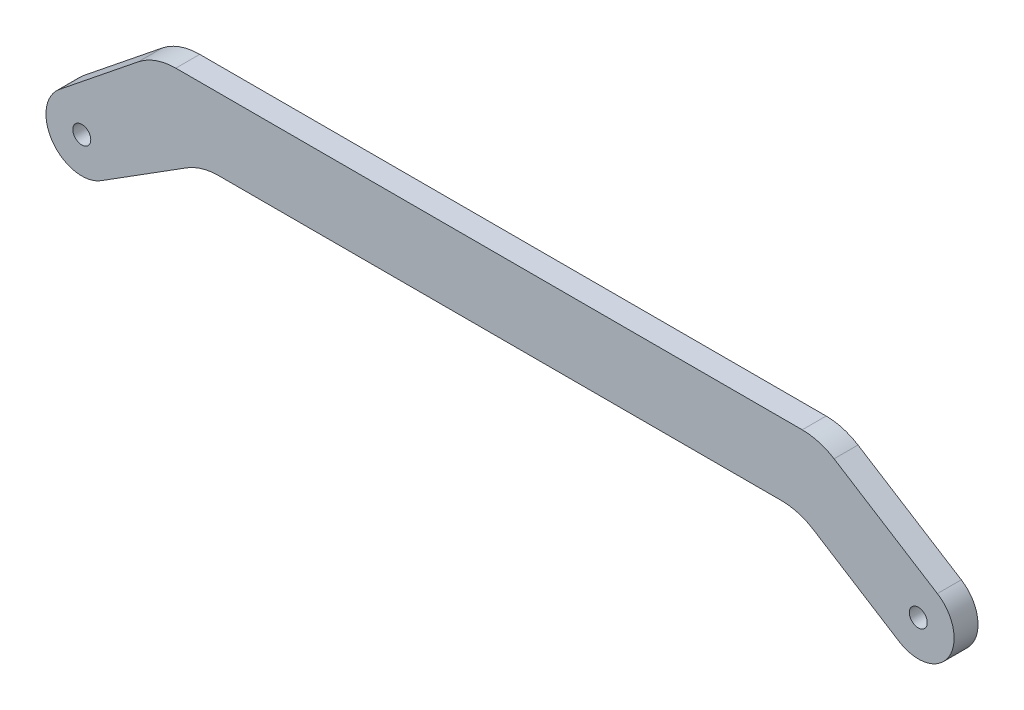
ISO-10303-21;
HEADER;
FILE_DESCRIPTION(('STEP AP214'),'2;1');
FILE_NAME('part.step','',(''),(''),'','','');
FILE_SCHEMA(('AUTOMOTIVE_DESIGN { 1 0 10303 214 1 1 1 1 }'));
ENDSEC;
DATA;
#1=APPLICATION_CONTEXT('core data for automotive mechanical design processes');
#2=APPLICATION_PROTOCOL_DEFINITION('international standard','automotive_design',2000,#1);
#3=PRODUCT_CONTEXT('',#1,'mechanical');
#4=PRODUCT('Part','Part','',(#3));
#5=PRODUCT_RELATED_PRODUCT_CATEGORY('part','',(#4));
#6=PRODUCT_DEFINITION_FORMATION('','',#4);
#7=PRODUCT_DEFINITION_CONTEXT('part definition',#1,'design');
#8=PRODUCT_DEFINITION('design','',#6,#7);
#9=PRODUCT_DEFINITION_SHAPE('','',#8);
#10=(LENGTH_UNIT() NAMED_UNIT(*) SI_UNIT(.MILLI.,.METRE.));
#11=(NAMED_UNIT(*) PLANE_ANGLE_UNIT() SI_UNIT($,.RADIAN.));
#12=(NAMED_UNIT(*) SI_UNIT($,.STERADIAN.) SOLID_ANGLE_UNIT());
#13=UNCERTAINTY_MEASURE_WITH_UNIT(LENGTH_MEASURE(1.E-05),#10,'distance_accuracy_value','');
#14=(GEOMETRIC_REPRESENTATION_CONTEXT(3) GLOBAL_UNCERTAINTY_ASSIGNED_CONTEXT((#13)) GLOBAL_UNIT_ASSIGNED_CONTEXT((#10,
#11,#12)) REPRESENTATION_CONTEXT('',''));
#15=CARTESIAN_POINT('',(0.,0.,0.));
#16=DIRECTION('',(0.,0.,1.));
#17=DIRECTION('',(1.,0.,0.));
#18=AXIS2_PLACEMENT_3D('',#15,#16,#17);
#19=CARTESIAN_POINT('',(15.7364952951131,7.50778352946216,4.));
#20=DIRECTION('',(0.,0.,-1.));
#21=DIRECTION('',(-1.,0.,0.));
#22=AXIS2_PLACEMENT_3D('',#19,#20,#21);
#23=CYLINDRICAL_SURFACE('',#22,10.);
#24=CARTESIAN_POINT('',(15.7364952951131,7.50778352946216,0.));
#25=DIRECTION('',(0.,0.,1.));
#26=DIRECTION('',(1.,0.,0.));
#27=AXIS2_PLACEMENT_3D('',#24,#25,#26);
#28=CIRCLE('',#27,10.);
#29=CARTESIAN_POINT('',(9.47479683384796,15.304650360452,0.));
#30=VERTEX_POINT('',#29);
#31=CARTESIAN_POINT('',(15.7364952951131,17.5077835294622,0.));
#32=VERTEX_POINT('',#31);
#33=EDGE_CURVE('E157',#30,#32,#28,.F.);
#34=ORIENTED_EDGE('',*,*,#33,.F.);
#35=DIRECTION('',(0.,0.,-1.));
#36=VECTOR('',#35,1.);
#37=CARTESIAN_POINT('',(9.47479683384796,15.304650360452,4.));
#38=LINE('',#37,#36);
#39=CARTESIAN_POINT('',(9.47479683384796,15.304650360452,4.));
#40=VERTEX_POINT('',#39);
#41=EDGE_CURVE('E11',#40,#30,#38,.T.);
#42=ORIENTED_EDGE('',*,*,#41,.F.);
#43=CARTESIAN_POINT('',(15.7364952951131,7.50778352946216,4.));
#44=DIRECTION('',(0.,0.,1.));
#45=DIRECTION('',(1.,0.,0.));
#46=AXIS2_PLACEMENT_3D('',#43,#44,#45);
#47=CIRCLE('',#46,10.);
#48=CARTESIAN_POINT('',(15.7364952951131,17.5077835294622,4.));
#49=VERTEX_POINT('',#48);
#50=EDGE_CURVE('E193',#40,#49,#47,.F.);
#51=ORIENTED_EDGE('',*,*,#50,.T.);
#52=DIRECTION('',(0.,0.,-1.));
#53=VECTOR('',#52,1.);
#54=CARTESIAN_POINT('',(15.7364952951131,17.5077835294622,4.));
#55=LINE('',#54,#53);
#56=EDGE_CURVE('E50',#49,#32,#55,.T.);
#57=ORIENTED_EDGE('',*,*,#56,.T.);
#58=EDGE_LOOP('',(#34,#42,#51,#57));
#59=FACE_BOUND('',#58,.T.);
#60=ADVANCED_FACE('F34',(#59),#23,.T.);
#61=CARTESIAN_POINT('',(-3.75701907675908,4.67812009859392,4.));
#62=DIRECTION('',(-0.626169846126513,0.779686683098986,0.));
#63=DIRECTION('',(-0.779686683098986,-0.626169846126513,0.));
#64=AXIS2_PLACEMENT_3D('',#61,#62,#63);
#65=PLANE('',#64);
#66=DIRECTION('',(0.779686683098986,0.626169846126513,0.));
#67=VECTOR('',#66,1.);
#68=CARTESIAN_POINT('',(-3.75701907675908,4.67812009859392,0.));
#69=LINE('',#68,#67);
#70=CARTESIAN_POINT('',(-3.75701907675908,4.67812009859392,0.));
#71=VERTEX_POINT('',#70);
#72=EDGE_CURVE('E159',#71,#30,#69,.T.);
#73=ORIENTED_EDGE('',*,*,#72,.F.);
#74=DIRECTION('',(0.,0.,-1.));
#75=VECTOR('',#74,1.);
#76=CARTESIAN_POINT('',(-3.75701907675908,4.67812009859392,4.));
#77=LINE('',#76,#75);
#78=CARTESIAN_POINT('',(-3.75701907675908,4.67812009859392,4.));
#79=VERTEX_POINT('',#78);
#80=EDGE_CURVE('E42',#79,#71,#77,.T.);
#81=ORIENTED_EDGE('',*,*,#80,.F.);
#82=DIRECTION('',(0.779686683098986,0.626169846126513,0.));
#83=VECTOR('',#82,1.);
#84=CARTESIAN_POINT('',(-3.75701907675908,4.67812009859392,4.));
#85=LINE('',#84,#83);
#86=EDGE_CURVE('E226',#79,#40,#85,.T.);
#87=ORIENTED_EDGE('',*,*,#86,.T.);
#88=ORIENTED_EDGE('',*,*,#41,.T.);
#89=EDGE_LOOP('',(#73,#81,#87,#88));
#90=FACE_BOUND('',#89,.T.);
#91=ADVANCED_FACE('F225',(#90),#65,.T.);
#92=CARTESIAN_POINT('',(0.,0.,4.));
#93=DIRECTION('',(0.,0.,-1.));
#94=DIRECTION('',(-1.,0.,0.));
#95=AXIS2_PLACEMENT_3D('',#92,#93,#94);
#96=CYLINDRICAL_SURFACE('',#95,6.);
#97=CARTESIAN_POINT('',(0.,0.,0.));
#98=DIRECTION('',(0.,0.,1.));
#99=DIRECTION('',(1.,0.,0.));
#100=AXIS2_PLACEMENT_3D('',#97,#98,#99);
#101=CIRCLE('',#100,6.);
#102=CARTESIAN_POINT('',(3.19805613686114,-5.07665607910215,0.));
#103=VERTEX_POINT('',#102);
#104=EDGE_CURVE('E162',#71,#103,#101,.T.);
#105=ORIENTED_EDGE('',*,*,#104,.T.);
#106=DIRECTION('',(0.,0.,-1.));
#107=VECTOR('',#106,1.);
#108=CARTESIAN_POINT('',(3.19805613686114,-5.07665607910215,4.));
#109=LINE('',#108,#107);
#110=CARTESIAN_POINT('',(3.19805613686114,-5.07665607910215,4.));
#111=VERTEX_POINT('',#110);
#112=EDGE_CURVE('E209',#111,#103,#109,.T.);
#113=ORIENTED_EDGE('',*,*,#112,.F.);
#114=CARTESIAN_POINT('',(0.,0.,4.));
#115=DIRECTION('',(0.,0.,1.));
#116=DIRECTION('',(1.,0.,0.));
#117=AXIS2_PLACEMENT_3D('',#114,#115,#116);
#118=CIRCLE('',#117,6.);
#119=EDGE_CURVE('E215',#79,#111,#118,.T.);
#120=ORIENTED_EDGE('',*,*,#119,.F.);
#121=ORIENTED_EDGE('',*,*,#80,.T.);
#122=EDGE_LOOP('',(#105,#113,#120,#121));
#123=FACE_BOUND('',#122,.T.);
#124=ADVANCED_FACE('F213',(#123),#96,.T.);
#125=CARTESIAN_POINT('',(3.19805613686114,-5.07665607910215,4.));
#126=DIRECTION('',(0.533009356143523,-0.846109346517025,0.));
#127=DIRECTION('',(0.846109346517025,0.533009356143523,0.));
#128=AXIS2_PLACEMENT_3D('',#125,#126,#127);
#129=PLANE('',#128);
#130=DIRECTION('',(-0.846109346517025,-0.533009356143523,0.));
#131=VECTOR('',#130,1.);
#132=CARTESIAN_POINT('',(3.19805613686114,-5.07665607910215,0.));
#133=LINE('',#132,#131);
#134=CARTESIAN_POINT('',(17.5571100440778,3.96887699463241,0.));
#135=VERTEX_POINT('',#134);
#136=EDGE_CURVE('E165',#135,#103,#133,.T.);
#137=ORIENTED_EDGE('',*,*,#136,.F.);
#138=DIRECTION('',(0.,0.,-1.));
#139=VECTOR('',#138,1.);
#140=CARTESIAN_POINT('',(17.5571100440778,3.96887699463241,4.));
#141=LINE('',#140,#139);
#142=CARTESIAN_POINT('',(17.5571100440778,3.96887699463241,4.));
#143=VERTEX_POINT('',#142);
#144=EDGE_CURVE('E207',#143,#135,#141,.T.);
#145=ORIENTED_EDGE('',*,*,#144,.F.);
#146=DIRECTION('',(-0.846109346517025,-0.533009356143523,0.));
#147=VECTOR('',#146,1.);
#148=CARTESIAN_POINT('',(3.19805613686114,-5.07665607910215,4.));
#149=LINE('',#148,#147);
#150=EDGE_CURVE('E385',#143,#111,#149,.T.);
#151=ORIENTED_EDGE('',*,*,#150,.T.);
#152=ORIENTED_EDGE('',*,*,#112,.T.);
#153=EDGE_LOOP('',(#137,#145,#151,#152));
#154=FACE_BOUND('',#153,.T.);
#155=ADVANCED_FACE('F248',(#154),#129,.T.);
#156=CARTESIAN_POINT('',(22.887203605513,-4.49221647053784,4.));
#157=DIRECTION('',(0.,0.,-1.));
#158=DIRECTION('',(-1.,0.,0.));
#159=AXIS2_PLACEMENT_3D('',#156,#157,#158);
#160=CYLINDRICAL_SURFACE('',#159,10.);
#161=CARTESIAN_POINT('',(22.887203605513,-4.49221647053784,0.));
#162=DIRECTION('',(0.,0.,1.));
#163=DIRECTION('',(1.,0.,0.));
#164=AXIS2_PLACEMENT_3D('',#161,#162,#163);
#165=CIRCLE('',#164,10.);
#166=CARTESIAN_POINT('',(22.887203605513,5.50778352946216,0.));
#167=VERTEX_POINT('',#166);
#168=EDGE_CURVE('E168',#135,#167,#165,.F.);
#169=ORIENTED_EDGE('',*,*,#168,.T.);
#170=DIRECTION('',(0.,0.,-1.));
#171=VECTOR('',#170,1.);
#172=CARTESIAN_POINT('',(22.887203605513,5.50778352946216,4.));
#173=LINE('',#172,#171);
#174=CARTESIAN_POINT('',(22.887203605513,5.50778352946216,4.));
#175=VERTEX_POINT('',#174);
#176=EDGE_CURVE('E204',#175,#167,#173,.T.);
#177=ORIENTED_EDGE('',*,*,#176,.F.);
#178=CARTESIAN_POINT('',(22.887203605513,-4.49221647053784,4.));
#179=DIRECTION('',(0.,0.,1.));
#180=DIRECTION('',(1.,0.,0.));
#181=AXIS2_PLACEMENT_3D('',#178,#179,#180);
#182=CIRCLE('',#181,10.);
#183=EDGE_CURVE('E386',#143,#175,#182,.F.);
#184=ORIENTED_EDGE('',*,*,#183,.F.);
#185=ORIENTED_EDGE('',*,*,#144,.T.);
#186=EDGE_LOOP('',(#169,#177,#184,#185));
#187=FACE_BOUND('',#186,.T.);
#188=ADVANCED_FACE('F253',(#187),#160,.F.);
#189=CARTESIAN_POINT('',(0.,5.50778352946216,4.));
#190=DIRECTION('',(0.,1.,0.));
#191=DIRECTION('',(-1.,0.,0.));
#192=AXIS2_PLACEMENT_3D('',#189,#190,#191);
#193=PLANE('',#192);
#194=DIRECTION('',(1.,0.,0.));
#195=VECTOR('',#194,1.);
#196=CARTESIAN_POINT('',(0.,5.50778352946216,0.));
#197=LINE('',#196,#195);
#198=CARTESIAN_POINT('',(117.112796394487,5.50778352946216,0.));
#199=VERTEX_POINT('',#198);
#200=EDGE_CURVE('E170',#167,#199,#197,.T.);
#201=ORIENTED_EDGE('',*,*,#200,.T.);
#202=DIRECTION('',(0.,0.,-1.));
#203=VECTOR('',#202,1.);
#204=CARTESIAN_POINT('',(117.112796394487,5.50778352946216,4.));
#205=LINE('',#204,#203);
#206=CARTESIAN_POINT('',(117.112796394487,5.50778352946216,4.));
#207=VERTEX_POINT('',#206);
#208=EDGE_CURVE('E202',#207,#199,#205,.T.);
#209=ORIENTED_EDGE('',*,*,#208,.F.);
#210=DIRECTION('',(1.,0.,0.));
#211=VECTOR('',#210,1.);
#212=CARTESIAN_POINT('',(0.,5.50778352946216,4.));
#213=LINE('',#212,#211);
#214=EDGE_CURVE('E388',#175,#207,#213,.T.);
#215=ORIENTED_EDGE('',*,*,#214,.F.);
#216=ORIENTED_EDGE('',*,*,#176,.T.);
#217=EDGE_LOOP('',(#201,#209,#215,#216));
#218=FACE_BOUND('',#217,.T.);
#219=ADVANCED_FACE('F257',(#218),#193,.F.);
#220=CARTESIAN_POINT('',(117.112796394487,-4.49221647053784,4.));
#221=DIRECTION('',(0.,0.,-1.));
#222=DIRECTION('',(-1.,0.,0.));
#223=AXIS2_PLACEMENT_3D('',#220,#221,#222);
#224=CYLINDRICAL_SURFACE('',#223,10.);
#225=CARTESIAN_POINT('',(117.112796394487,-4.49221647053784,0.));
#226=DIRECTION('',(0.,0.,1.));
#227=DIRECTION('',(1.,0.,0.));
#228=AXIS2_PLACEMENT_3D('',#225,#226,#227);
#229=CIRCLE('',#228,10.);
#230=CARTESIAN_POINT('',(122.442889955922,3.96887699463241,0.));
#231=VERTEX_POINT('',#230);
#232=EDGE_CURVE('E173',#231,#199,#229,.T.);
#233=ORIENTED_EDGE('',*,*,#232,.F.);
#234=DIRECTION('',(0.,0.,-1.));
#235=VECTOR('',#234,1.);
#236=CARTESIAN_POINT('',(122.442889955922,3.96887699463241,4.));
#237=LINE('',#236,#235);
#238=CARTESIAN_POINT('',(122.442889955922,3.96887699463241,4.));
#239=VERTEX_POINT('',#238);
#240=EDGE_CURVE('E200',#239,#231,#237,.T.);
#241=ORIENTED_EDGE('',*,*,#240,.F.);
#242=CARTESIAN_POINT('',(117.112796394487,-4.49221647053784,4.));
#243=DIRECTION('',(0.,0.,1.));
#244=DIRECTION('',(1.,0.,0.));
#245=AXIS2_PLACEMENT_3D('',#242,#243,#244);
#246=CIRCLE('',#245,10.);
#247=EDGE_CURVE('E379',#239,#207,#246,.T.);
#248=ORIENTED_EDGE('',*,*,#247,.T.);
#249=ORIENTED_EDGE('',*,*,#208,.T.);
#250=EDGE_LOOP('',(#233,#241,#248,#249));
#251=FACE_BOUND('',#250,.T.);
#252=ADVANCED_FACE('F261',(#251),#224,.F.);
#253=CARTESIAN_POINT('',(36.5758001862535,58.0611316428658,4.));
#254=DIRECTION('',(0.533009356143524,0.846109346517025,0.));
#255=DIRECTION('',(-0.846109346517025,0.533009356143524,0.));
#256=AXIS2_PLACEMENT_3D('',#253,#254,#255);
#257=PLANE('',#256);
#258=DIRECTION('',(0.846109346517025,-0.533009356143524,0.));
#259=VECTOR('',#258,1.);
#260=CARTESIAN_POINT('',(36.5758001862535,58.0611316428658,0.));
#261=LINE('',#260,#259);
#262=CARTESIAN_POINT('',(136.801943863139,-5.07665607910217,0.));
#263=VERTEX_POINT('',#262);
#264=EDGE_CURVE('E176',#231,#263,#261,.T.);
#265=ORIENTED_EDGE('',*,*,#264,.T.);
#266=DIRECTION('',(0.,0.,-1.));
#267=VECTOR('',#266,1.);
#268=CARTESIAN_POINT('',(136.801943863139,-5.07665607910217,4.));
#269=LINE('',#268,#267);
#270=CARTESIAN_POINT('',(136.801943863139,-5.07665607910217,4.));
#271=VERTEX_POINT('',#270);
#272=EDGE_CURVE('E197',#271,#263,#269,.T.);
#273=ORIENTED_EDGE('',*,*,#272,.F.);
#274=DIRECTION('',(0.846109346517025,-0.533009356143524,0.));
#275=VECTOR('',#274,1.);
#276=CARTESIAN_POINT('',(36.5758001862535,58.0611316428658,4.));
#277=LINE('',#276,#275);
#278=EDGE_CURVE('E395',#239,#271,#277,.T.);
#279=ORIENTED_EDGE('',*,*,#278,.F.);
#280=ORIENTED_EDGE('',*,*,#240,.T.);
#281=EDGE_LOOP('',(#265,#273,#279,#280));
#282=FACE_BOUND('',#281,.T.);
#283=ADVANCED_FACE('F265',(#282),#257,.F.);
#284=CARTESIAN_POINT('',(140.,0.,4.));
#285=DIRECTION('',(0.,0.,-1.));
#286=DIRECTION('',(-1.,0.,0.));
#287=AXIS2_PLACEMENT_3D('',#284,#285,#286);
#288=CYLINDRICAL_SURFACE('',#287,6.);
#289=CARTESIAN_POINT('',(140.,0.,0.));
#290=DIRECTION('',(0.,0.,1.));
#291=DIRECTION('',(1.,0.,0.));
#292=AXIS2_PLACEMENT_3D('',#289,#290,#291);
#293=CIRCLE('',#292,6.);
#294=CARTESIAN_POINT('',(143.198056136861,5.07665607910213,0.));
#295=VERTEX_POINT('',#294);
#296=EDGE_CURVE('E178',#263,#295,#293,.T.);
#297=ORIENTED_EDGE('',*,*,#296,.T.);
#298=DIRECTION('',(0.,0.,-1.));
#299=VECTOR('',#298,1.);
#300=CARTESIAN_POINT('',(143.198056136861,5.07665607910213,4.));
#301=LINE('',#300,#299);
#302=CARTESIAN_POINT('',(143.198056136861,5.07665607910213,4.));
#303=VERTEX_POINT('',#302);
#304=EDGE_CURVE('E133',#303,#295,#301,.T.);
#305=ORIENTED_EDGE('',*,*,#304,.F.);
#306=CARTESIAN_POINT('',(140.,0.,4.));
#307=DIRECTION('',(0.,0.,1.));
#308=DIRECTION('',(1.,0.,0.));
#309=AXIS2_PLACEMENT_3D('',#306,#307,#308);
#310=CIRCLE('',#309,6.);
#311=EDGE_CURVE('E142',#271,#303,#310,.T.);
#312=ORIENTED_EDGE('',*,*,#311,.F.);
#313=ORIENTED_EDGE('',*,*,#272,.T.);
#314=EDGE_LOOP('',(#297,#305,#312,#313));
#315=FACE_BOUND('',#314,.T.);
#316=ADVANCED_FACE('F269',(#315),#288,.T.);
#317=CARTESIAN_POINT('',(42.9719124599757,68.21444380107,4.));
#318=DIRECTION('',(0.533009356143523,0.846109346517025,0.));
#319=DIRECTION('',(-0.846109346517025,0.533009356143523,0.));
#320=AXIS2_PLACEMENT_3D('',#317,#318,#319);
#321=PLANE('',#320);
#322=DIRECTION('',(0.846109346517025,-0.533009356143523,0.));
#323=VECTOR('',#322,1.);
#324=CARTESIAN_POINT('',(42.9719124599757,68.21444380107,0.));
#325=LINE('',#324,#323);
#326=CARTESIAN_POINT('',(125.907534282538,15.9688769946324,0.));
#327=VERTEX_POINT('',#326);
#328=EDGE_CURVE('E129',#327,#295,#325,.T.);
#329=ORIENTED_EDGE('',*,*,#328,.F.);
#330=DIRECTION('',(0.,0.,-1.));
#331=VECTOR('',#330,1.);
#332=CARTESIAN_POINT('',(125.907534282538,15.9688769946324,4.));
#333=LINE('',#332,#331);
#334=CARTESIAN_POINT('',(125.907534282538,15.9688769946324,4.));
#335=VERTEX_POINT('',#334);
#336=EDGE_CURVE('E124',#335,#327,#333,.T.);
#337=ORIENTED_EDGE('',*,*,#336,.F.);
#338=DIRECTION('',(0.846109346517025,-0.533009356143523,0.));
#339=VECTOR('',#338,1.);
#340=CARTESIAN_POINT('',(42.9719124599757,68.21444380107,4.));
#341=LINE('',#340,#339);
#342=EDGE_CURVE('E127',#335,#303,#341,.T.);
#343=ORIENTED_EDGE('',*,*,#342,.T.);
#344=ORIENTED_EDGE('',*,*,#304,.T.);
#345=EDGE_LOOP('',(#329,#337,#343,#344));
#346=FACE_BOUND('',#345,.T.);
#347=ADVANCED_FACE('F126',(#346),#321,.T.);
#348=CARTESIAN_POINT('',(120.577440721103,7.50778352946216,4.));
#349=DIRECTION('',(0.,0.,-1.));
#350=DIRECTION('',(-1.,0.,0.));
#351=AXIS2_PLACEMENT_3D('',#348,#349,#350);
#352=CYLINDRICAL_SURFACE('',#351,9.99999999999999);
#353=CARTESIAN_POINT('',(120.577440721103,7.50778352946216,0.));
#354=DIRECTION('',(0.,0.,1.));
#355=DIRECTION('',(1.,0.,0.));
#356=AXIS2_PLACEMENT_3D('',#353,#354,#355);
#357=CIRCLE('',#356,9.99999999999999);
#358=CARTESIAN_POINT('',(120.577440721103,17.5077835294622,0.));
#359=VERTEX_POINT('',#358);
#360=EDGE_CURVE('E182',#359,#327,#357,.F.);
#361=ORIENTED_EDGE('',*,*,#360,.F.);
#362=DIRECTION('',(0.,0.,-1.));
#363=VECTOR('',#362,1.);
#364=CARTESIAN_POINT('',(120.577440721103,17.5077835294622,4.));
#365=LINE('',#364,#363);
#366=CARTESIAN_POINT('',(120.577440721103,17.5077835294622,4.));
#367=VERTEX_POINT('',#366);
#368=EDGE_CURVE('E87',#367,#359,#365,.T.);
#369=ORIENTED_EDGE('',*,*,#368,.F.);
#370=CARTESIAN_POINT('',(120.577440721103,7.50778352946216,4.));
#371=DIRECTION('',(0.,0.,1.));
#372=DIRECTION('',(1.,0.,0.));
#373=AXIS2_PLACEMENT_3D('',#370,#371,#372);
#374=CIRCLE('',#373,9.99999999999999);
#375=EDGE_CURVE('E140',#367,#335,#374,.F.);
#376=ORIENTED_EDGE('',*,*,#375,.T.);
#377=ORIENTED_EDGE('',*,*,#336,.T.);
#378=EDGE_LOOP('',(#361,#369,#376,#377));
#379=FACE_BOUND('',#378,.T.);
#380=ADVANCED_FACE('F145',(#379),#352,.T.);
#381=CARTESIAN_POINT('',(140.,0.,4.));
#382=DIRECTION('',(0.,0.,-1.));
#383=DIRECTION('',(-1.,0.,0.));
#384=AXIS2_PLACEMENT_3D('',#381,#382,#383);
#385=CYLINDRICAL_SURFACE('',#384,1.5);
#386=CARTESIAN_POINT('',(140.,0.,4.));
#387=DIRECTION('',(0.,0.,1.));
#388=DIRECTION('',(1.,0.,0.));
#389=AXIS2_PLACEMENT_3D('',#386,#387,#388);
#390=CIRCLE('',#389,1.5);
#391=CARTESIAN_POINT('',(141.5,0.,4.));
#392=VERTEX_POINT('',#391);
#393=EDGE_CURVE('E148',#392,#392,#390,.T.);
#394=ORIENTED_EDGE('',*,*,#393,.T.);
#395=EDGE_LOOP('',(#394));
#396=FACE_BOUND('',#395,.T.);
#397=CARTESIAN_POINT('',(140.,0.,0.));
#398=DIRECTION('',(0.,0.,1.));
#399=DIRECTION('',(1.,0.,0.));
#400=AXIS2_PLACEMENT_3D('',#397,#398,#399);
#401=CIRCLE('',#400,1.5);
#402=CARTESIAN_POINT('',(141.5,0.,0.));
#403=VERTEX_POINT('',#402);
#404=EDGE_CURVE('E187',#403,#403,#401,.T.);
#405=ORIENTED_EDGE('',*,*,#404,.F.);
#406=EDGE_LOOP('',(#405));
#407=FACE_BOUND('',#406,.T.);
#408=ADVANCED_FACE('F230',(#396,#407),#385,.F.);
#409=CARTESIAN_POINT('',(0.,17.5077835294622,4.));
#410=DIRECTION('',(0.,1.,0.));
#411=DIRECTION('',(-1.,0.,0.));
#412=AXIS2_PLACEMENT_3D('',#409,#410,#411);
#413=PLANE('',#412);
#414=DIRECTION('',(1.,0.,0.));
#415=VECTOR('',#414,1.);
#416=CARTESIAN_POINT('',(0.,17.5077835294622,0.));
#417=LINE('',#416,#415);
#418=EDGE_CURVE('E184',#32,#359,#417,.T.);
#419=ORIENTED_EDGE('',*,*,#418,.F.);
#420=ORIENTED_EDGE('',*,*,#56,.F.);
#421=DIRECTION('',(1.,0.,0.));
#422=VECTOR('',#421,1.);
#423=CARTESIAN_POINT('',(0.,17.5077835294622,4.));
#424=LINE('',#423,#422);
#425=EDGE_CURVE('E146',#49,#367,#424,.T.);
#426=ORIENTED_EDGE('',*,*,#425,.T.);
#427=ORIENTED_EDGE('',*,*,#368,.T.);
#428=EDGE_LOOP('',(#419,#420,#426,#427));
#429=FACE_BOUND('',#428,.T.);
#430=ADVANCED_FACE('F227',(#429),#413,.T.);
#431=CARTESIAN_POINT('',(0.,0.,4.));
#432=DIRECTION('',(0.,0.,-1.));
#433=DIRECTION('',(-1.,0.,0.));
#434=AXIS2_PLACEMENT_3D('',#431,#432,#433);
#435=CYLINDRICAL_SURFACE('',#434,1.5);
#436=CARTESIAN_POINT('',(0.,0.,4.));
#437=DIRECTION('',(0.,0.,1.));
#438=DIRECTION('',(1.,0.,0.));
#439=AXIS2_PLACEMENT_3D('',#436,#437,#438);
#440=CIRCLE('',#439,1.5);
#441=CARTESIAN_POINT('',(1.5,0.,4.));
#442=VERTEX_POINT('',#441);
#443=EDGE_CURVE('E154',#442,#442,#440,.T.);
#444=ORIENTED_EDGE('',*,*,#443,.T.);
#445=EDGE_LOOP('',(#444));
#446=FACE_BOUND('',#445,.T.);
#447=CARTESIAN_POINT('',(0.,0.,0.));
#448=DIRECTION('',(0.,0.,1.));
#449=DIRECTION('',(1.,0.,0.));
#450=AXIS2_PLACEMENT_3D('',#447,#448,#449);
#451=CIRCLE('',#450,1.5);
#452=CARTESIAN_POINT('',(1.5,0.,0.));
#453=VERTEX_POINT('',#452);
#454=EDGE_CURVE('E190',#453,#453,#451,.T.);
#455=ORIENTED_EDGE('',*,*,#454,.F.);
#456=EDGE_LOOP('',(#455));
#457=FACE_BOUND('',#456,.T.);
#458=ADVANCED_FACE('F229',(#446,#457),#435,.F.);
#459=CARTESIAN_POINT('',(0.,0.,4.));
#460=DIRECTION('',(0.,0.,1.));
#461=DIRECTION('',(1.,0.,0.));
#462=AXIS2_PLACEMENT_3D('',#459,#460,#461);
#463=PLANE('',#462);
#464=ORIENTED_EDGE('',*,*,#50,.F.);
#465=ORIENTED_EDGE('',*,*,#86,.F.);
#466=ORIENTED_EDGE('',*,*,#119,.T.);
#467=ORIENTED_EDGE('',*,*,#150,.F.);
#468=ORIENTED_EDGE('',*,*,#183,.T.);
#469=ORIENTED_EDGE('',*,*,#214,.T.);
#470=ORIENTED_EDGE('',*,*,#247,.F.);
#471=ORIENTED_EDGE('',*,*,#278,.T.);
#472=ORIENTED_EDGE('',*,*,#311,.T.);
#473=ORIENTED_EDGE('',*,*,#342,.F.);
#474=ORIENTED_EDGE('',*,*,#375,.F.);
#475=ORIENTED_EDGE('',*,*,#425,.F.);
#476=EDGE_LOOP('',(#464,#465,#466,#467,#468,#469,#470,#471,#472,#473,#474,#475));
#477=FACE_BOUND('',#476,.T.);
#478=ORIENTED_EDGE('',*,*,#393,.F.);
#479=EDGE_LOOP('',(#478));
#480=FACE_BOUND('',#479,.T.);
#481=ORIENTED_EDGE('',*,*,#443,.F.);
#482=EDGE_LOOP('',(#481));
#483=FACE_BOUND('',#482,.T.);
#484=ADVANCED_FACE('F137',(#477,#480,#483),#463,.T.);
#485=CARTESIAN_POINT('',(0.,0.,0.));
#486=DIRECTION('',(0.,0.,1.));
#487=DIRECTION('',(1.,0.,0.));
#488=AXIS2_PLACEMENT_3D('',#485,#486,#487);
#489=PLANE('',#488);
#490=ORIENTED_EDGE('',*,*,#33,.T.);
#491=ORIENTED_EDGE('',*,*,#418,.T.);
#492=ORIENTED_EDGE('',*,*,#360,.T.);
#493=ORIENTED_EDGE('',*,*,#328,.T.);
#494=ORIENTED_EDGE('',*,*,#296,.F.);
#495=ORIENTED_EDGE('',*,*,#264,.F.);
#496=ORIENTED_EDGE('',*,*,#232,.T.);
#497=ORIENTED_EDGE('',*,*,#200,.F.);
#498=ORIENTED_EDGE('',*,*,#168,.F.);
#499=ORIENTED_EDGE('',*,*,#136,.T.);
#500=ORIENTED_EDGE('',*,*,#104,.F.);
#501=ORIENTED_EDGE('',*,*,#72,.T.);
#502=EDGE_LOOP('',(#490,#491,#492,#493,#494,#495,#496,#497,#498,#499,#500,#501));
#503=FACE_BOUND('',#502,.T.);
#504=ORIENTED_EDGE('',*,*,#404,.T.);
#505=EDGE_LOOP('',(#504));
#506=FACE_BOUND('',#505,.T.);
#507=ORIENTED_EDGE('',*,*,#454,.T.);
#508=EDGE_LOOP('',(#507));
#509=FACE_BOUND('',#508,.T.);
#510=ADVANCED_FACE('F221',(#503,#506,#509),#489,.F.);
#511=CLOSED_SHELL('',(#60,#91,#124,#155,#188,#219,#252,#283,#316,#347,#380,#408,#430,#458,#484,#510));
#512=MANIFOLD_SOLID_BREP('B2',#511);
#513=ADVANCED_BREP_SHAPE_REPRESENTATION('',(#18,#512),#14);
#514=SHAPE_DEFINITION_REPRESENTATION(#9,#513);
ENDSEC;
END-ISO-10303-21;
